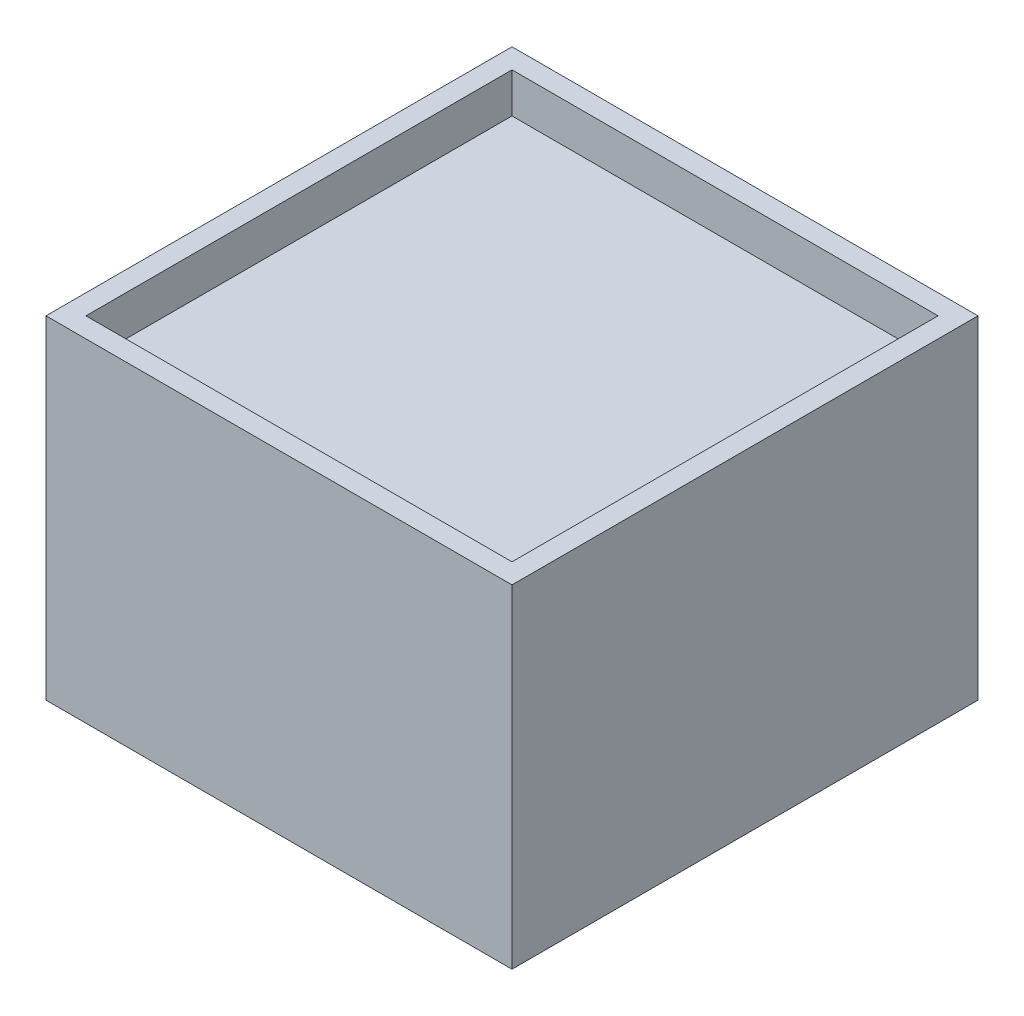
ISO-10303-21;
HEADER;
FILE_DESCRIPTION(('STEP AP214'),'2;1');
FILE_NAME('part.step','',(''),(''),'','','');
FILE_SCHEMA(('AUTOMOTIVE_DESIGN { 1 0 10303 214 1 1 1 1 }'));
ENDSEC;
DATA;
#1=APPLICATION_CONTEXT('core data for automotive mechanical design processes');
#2=APPLICATION_PROTOCOL_DEFINITION('international standard','automotive_design',2000,#1);
#3=PRODUCT_CONTEXT('',#1,'mechanical');
#4=PRODUCT('Part','Part','',(#3));
#5=PRODUCT_RELATED_PRODUCT_CATEGORY('part','',(#4));
#6=PRODUCT_DEFINITION_FORMATION('','',#4);
#7=PRODUCT_DEFINITION_CONTEXT('part definition',#1,'design');
#8=PRODUCT_DEFINITION('design','',#6,#7);
#9=PRODUCT_DEFINITION_SHAPE('','',#8);
#10=(LENGTH_UNIT() NAMED_UNIT(*) SI_UNIT(.MILLI.,.METRE.));
#11=(NAMED_UNIT(*) PLANE_ANGLE_UNIT() SI_UNIT($,.RADIAN.));
#12=(NAMED_UNIT(*) SI_UNIT($,.STERADIAN.) SOLID_ANGLE_UNIT());
#13=UNCERTAINTY_MEASURE_WITH_UNIT(LENGTH_MEASURE(1.E-05),#10,'distance_accuracy_value','');
#14=(GEOMETRIC_REPRESENTATION_CONTEXT(3) GLOBAL_UNCERTAINTY_ASSIGNED_CONTEXT((#13)) GLOBAL_UNIT_ASSIGNED_CONTEXT((#10,
#11,#12)) REPRESENTATION_CONTEXT('',''));
#15=CARTESIAN_POINT('',(0.,0.,0.));
#16=DIRECTION('',(0.,0.,1.));
#17=DIRECTION('',(1.,0.,0.));
#18=AXIS2_PLACEMENT_3D('',#15,#16,#17);
#19=CARTESIAN_POINT('',(17.5,25.,-17.5));
#20=DIRECTION('',(-1.,0.,0.));
#21=DIRECTION('',(0.,0.,1.));
#22=AXIS2_PLACEMENT_3D('',#19,#20,#21);
#23=PLANE('',#22);
#24=DIRECTION('',(0.,0.,-1.));
#25=VECTOR('',#24,1.);
#26=CARTESIAN_POINT('',(17.5,0.,-17.5));
#27=LINE('',#26,#25);
#28=CARTESIAN_POINT('',(17.5,0.,17.5));
#29=VERTEX_POINT('',#28);
#30=CARTESIAN_POINT('',(17.5,0.,-17.5));
#31=VERTEX_POINT('',#30);
#32=EDGE_CURVE('E164',#29,#31,#27,.T.);
#33=ORIENTED_EDGE('',*,*,#32,.T.);
#34=DIRECTION('',(0.,-1.,0.));
#35=VECTOR('',#34,1.);
#36=CARTESIAN_POINT('',(17.5,25.,-17.5));
#37=LINE('',#36,#35);
#38=CARTESIAN_POINT('',(17.5,25.,-17.5));
#39=VERTEX_POINT('',#38);
#40=EDGE_CURVE('E11',#39,#31,#37,.T.);
#41=ORIENTED_EDGE('',*,*,#40,.F.);
#42=DIRECTION('',(0.,0.,-1.));
#43=VECTOR('',#42,1.);
#44=CARTESIAN_POINT('',(17.5,25.,-17.5));
#45=LINE('',#44,#43);
#46=CARTESIAN_POINT('',(17.5,25.,17.5));
#47=VERTEX_POINT('',#46);
#48=EDGE_CURVE('E170',#47,#39,#45,.T.);
#49=ORIENTED_EDGE('',*,*,#48,.F.);
#50=DIRECTION('',(0.,-1.,0.));
#51=VECTOR('',#50,1.);
#52=CARTESIAN_POINT('',(17.5,25.,17.5));
#53=LINE('',#52,#51);
#54=EDGE_CURVE('E180',#47,#29,#53,.T.);
#55=ORIENTED_EDGE('',*,*,#54,.T.);
#56=EDGE_LOOP('',(#33,#41,#49,#55));
#57=FACE_BOUND('',#56,.T.);
#58=ADVANCED_FACE('F45',(#57),#23,.F.);
#59=CARTESIAN_POINT('',(-17.5,25.,-17.5));
#60=DIRECTION('',(0.,0.,1.));
#61=DIRECTION('',(1.,0.,0.));
#62=AXIS2_PLACEMENT_3D('',#59,#60,#61);
#63=PLANE('',#62);
#64=DIRECTION('',(-1.,0.,0.));
#65=VECTOR('',#64,1.);
#66=CARTESIAN_POINT('',(-17.5,0.,-17.5));
#67=LINE('',#66,#65);
#68=CARTESIAN_POINT('',(-17.5,0.,-17.5));
#69=VERTEX_POINT('',#68);
#70=EDGE_CURVE('E184',#31,#69,#67,.T.);
#71=ORIENTED_EDGE('',*,*,#70,.T.);
#72=DIRECTION('',(0.,-1.,0.));
#73=VECTOR('',#72,1.);
#74=CARTESIAN_POINT('',(-17.5,25.,-17.5));
#75=LINE('',#74,#73);
#76=CARTESIAN_POINT('',(-17.5,25.,-17.5));
#77=VERTEX_POINT('',#76);
#78=EDGE_CURVE('E53',#77,#69,#75,.T.);
#79=ORIENTED_EDGE('',*,*,#78,.F.);
#80=DIRECTION('',(-1.,0.,0.));
#81=VECTOR('',#80,1.);
#82=CARTESIAN_POINT('',(-17.5,25.,-17.5));
#83=LINE('',#82,#81);
#84=EDGE_CURVE('E97',#39,#77,#83,.T.);
#85=ORIENTED_EDGE('',*,*,#84,.F.);
#86=ORIENTED_EDGE('',*,*,#40,.T.);
#87=EDGE_LOOP('',(#71,#79,#85,#86));
#88=FACE_BOUND('',#87,.T.);
#89=ADVANCED_FACE('F220',(#88),#63,.F.);
#90=CARTESIAN_POINT('',(-17.5,25.,-17.5));
#91=DIRECTION('',(1.,0.,0.));
#92=DIRECTION('',(0.,0.,-1.));
#93=AXIS2_PLACEMENT_3D('',#90,#91,#92);
#94=PLANE('',#93);
#95=DIRECTION('',(0.,0.,1.));
#96=VECTOR('',#95,1.);
#97=CARTESIAN_POINT('',(-17.5,0.,-17.5));
#98=LINE('',#97,#96);
#99=CARTESIAN_POINT('',(-17.5,0.,17.5));
#100=VERTEX_POINT('',#99);
#101=EDGE_CURVE('E187',#69,#100,#98,.T.);
#102=ORIENTED_EDGE('',*,*,#101,.T.);
#103=DIRECTION('',(0.,-1.,0.));
#104=VECTOR('',#103,1.);
#105=CARTESIAN_POINT('',(-17.5,25.,17.5));
#106=LINE('',#105,#104);
#107=CARTESIAN_POINT('',(-17.5,25.,17.5));
#108=VERTEX_POINT('',#107);
#109=EDGE_CURVE('E194',#108,#100,#106,.T.);
#110=ORIENTED_EDGE('',*,*,#109,.F.);
#111=DIRECTION('',(0.,0.,1.));
#112=VECTOR('',#111,1.);
#113=CARTESIAN_POINT('',(-17.5,25.,-17.5));
#114=LINE('',#113,#112);
#115=EDGE_CURVE('E175',#77,#108,#114,.T.);
#116=ORIENTED_EDGE('',*,*,#115,.F.);
#117=ORIENTED_EDGE('',*,*,#78,.T.);
#118=EDGE_LOOP('',(#102,#110,#116,#117));
#119=FACE_BOUND('',#118,.T.);
#120=ADVANCED_FACE('F201',(#119),#94,.F.);
#121=CARTESIAN_POINT('',(-17.5,25.,17.5));
#122=DIRECTION('',(0.,0.,-1.));
#123=DIRECTION('',(-1.,0.,0.));
#124=AXIS2_PLACEMENT_3D('',#121,#122,#123);
#125=PLANE('',#124);
#126=DIRECTION('',(1.,0.,0.));
#127=VECTOR('',#126,1.);
#128=CARTESIAN_POINT('',(-17.5,0.,17.5));
#129=LINE('',#128,#127);
#130=EDGE_CURVE('E90',#100,#29,#129,.T.);
#131=ORIENTED_EDGE('',*,*,#130,.T.);
#132=ORIENTED_EDGE('',*,*,#54,.F.);
#133=DIRECTION('',(1.,0.,0.));
#134=VECTOR('',#133,1.);
#135=CARTESIAN_POINT('',(-17.5,25.,17.5));
#136=LINE('',#135,#134);
#137=EDGE_CURVE('E69',#108,#47,#136,.T.);
#138=ORIENTED_EDGE('',*,*,#137,.F.);
#139=ORIENTED_EDGE('',*,*,#109,.T.);
#140=EDGE_LOOP('',(#131,#132,#138,#139));
#141=FACE_BOUND('',#140,.T.);
#142=ADVANCED_FACE('F209',(#141),#125,.F.);
#143=CARTESIAN_POINT('',(0.,25.,0.));
#144=DIRECTION('',(0.,1.,0.));
#145=DIRECTION('',(0.,0.,1.));
#146=AXIS2_PLACEMENT_3D('',#143,#144,#145);
#147=PLANE('',#146);
#148=DIRECTION('',(0.,0.,-1.));
#149=VECTOR('',#148,1.);
#150=CARTESIAN_POINT('',(16.,25.,-16.));
#151=LINE('',#150,#149);
#152=CARTESIAN_POINT('',(16.,25.,16.));
#153=VERTEX_POINT('',#152);
#154=CARTESIAN_POINT('',(16.,25.,-16.));
#155=VERTEX_POINT('',#154);
#156=EDGE_CURVE('E60',#153,#155,#151,.T.);
#157=ORIENTED_EDGE('',*,*,#156,.F.);
#158=DIRECTION('',(1.,0.,0.));
#159=VECTOR('',#158,1.);
#160=CARTESIAN_POINT('',(-16.,25.,16.));
#161=LINE('',#160,#159);
#162=CARTESIAN_POINT('',(-16.,25.,16.));
#163=VERTEX_POINT('',#162);
#164=EDGE_CURVE('E142',#163,#153,#161,.T.);
#165=ORIENTED_EDGE('',*,*,#164,.F.);
#166=DIRECTION('',(0.,0.,1.));
#167=VECTOR('',#166,1.);
#168=CARTESIAN_POINT('',(-16.,25.,-16.));
#169=LINE('',#168,#167);
#170=CARTESIAN_POINT('',(-16.,25.,-16.));
#171=VERTEX_POINT('',#170);
#172=EDGE_CURVE('E146',#171,#163,#169,.T.);
#173=ORIENTED_EDGE('',*,*,#172,.F.);
#174=DIRECTION('',(-1.,0.,0.));
#175=VECTOR('',#174,1.);
#176=CARTESIAN_POINT('',(-16.,25.,-16.));
#177=LINE('',#176,#175);
#178=EDGE_CURVE('E155',#155,#171,#177,.T.);
#179=ORIENTED_EDGE('',*,*,#178,.F.);
#180=EDGE_LOOP('',(#157,#165,#173,#179));
#181=FACE_BOUND('',#180,.T.);
#182=ORIENTED_EDGE('',*,*,#48,.T.);
#183=ORIENTED_EDGE('',*,*,#84,.T.);
#184=ORIENTED_EDGE('',*,*,#115,.T.);
#185=ORIENTED_EDGE('',*,*,#137,.T.);
#186=EDGE_LOOP('',(#182,#183,#184,#185));
#187=FACE_BOUND('',#186,.T.);
#188=ADVANCED_FACE('F211',(#181,#187),#147,.T.);
#189=CARTESIAN_POINT('',(0.,0.,0.));
#190=DIRECTION('',(0.,1.,0.));
#191=DIRECTION('',(0.,0.,1.));
#192=AXIS2_PLACEMENT_3D('',#189,#190,#191);
#193=PLANE('',#192);
#194=ORIENTED_EDGE('',*,*,#32,.F.);
#195=ORIENTED_EDGE('',*,*,#130,.F.);
#196=ORIENTED_EDGE('',*,*,#101,.F.);
#197=ORIENTED_EDGE('',*,*,#70,.F.);
#198=EDGE_LOOP('',(#194,#195,#196,#197));
#199=FACE_BOUND('',#198,.T.);
#200=ADVANCED_FACE('F205',(#199),#193,.F.);
#201=CARTESIAN_POINT('',(16.,22.,-16.));
#202=DIRECTION('',(1.,0.,0.));
#203=DIRECTION('',(0.,0.,-1.));
#204=AXIS2_PLACEMENT_3D('',#201,#202,#203);
#205=PLANE('',#204);
#206=ORIENTED_EDGE('',*,*,#156,.T.);
#207=DIRECTION('',(0.,1.,0.));
#208=VECTOR('',#207,1.);
#209=CARTESIAN_POINT('',(16.,22.,-16.));
#210=LINE('',#209,#208);
#211=CARTESIAN_POINT('',(16.,22.,-16.));
#212=VERTEX_POINT('',#211);
#213=EDGE_CURVE('E117',#212,#155,#210,.T.);
#214=ORIENTED_EDGE('',*,*,#213,.F.);
#215=DIRECTION('',(0.,0.,-1.));
#216=VECTOR('',#215,1.);
#217=CARTESIAN_POINT('',(16.,22.,-16.));
#218=LINE('',#217,#216);
#219=CARTESIAN_POINT('',(16.,22.,16.));
#220=VERTEX_POINT('',#219);
#221=EDGE_CURVE('E121',#220,#212,#218,.T.);
#222=ORIENTED_EDGE('',*,*,#221,.F.);
#223=DIRECTION('',(0.,1.,0.));
#224=VECTOR('',#223,1.);
#225=CARTESIAN_POINT('',(16.,22.,16.));
#226=LINE('',#225,#224);
#227=EDGE_CURVE('E161',#220,#153,#226,.T.);
#228=ORIENTED_EDGE('',*,*,#227,.T.);
#229=EDGE_LOOP('',(#206,#214,#222,#228));
#230=FACE_BOUND('',#229,.T.);
#231=ADVANCED_FACE('F119',(#230),#205,.F.);
#232=CARTESIAN_POINT('',(-16.,22.,16.));
#233=DIRECTION('',(0.,0.,1.));
#234=DIRECTION('',(1.,0.,0.));
#235=AXIS2_PLACEMENT_3D('',#232,#233,#234);
#236=PLANE('',#235);
#237=ORIENTED_EDGE('',*,*,#164,.T.);
#238=ORIENTED_EDGE('',*,*,#227,.F.);
#239=DIRECTION('',(1.,0.,0.));
#240=VECTOR('',#239,1.);
#241=CARTESIAN_POINT('',(-16.,22.,16.));
#242=LINE('',#241,#240);
#243=CARTESIAN_POINT('',(-16.,22.,16.));
#244=VERTEX_POINT('',#243);
#245=EDGE_CURVE('E128',#244,#220,#242,.T.);
#246=ORIENTED_EDGE('',*,*,#245,.F.);
#247=DIRECTION('',(0.,1.,0.));
#248=VECTOR('',#247,1.);
#249=CARTESIAN_POINT('',(-16.,22.,16.));
#250=LINE('',#249,#248);
#251=EDGE_CURVE('E165',#244,#163,#250,.T.);
#252=ORIENTED_EDGE('',*,*,#251,.T.);
#253=EDGE_LOOP('',(#237,#238,#246,#252));
#254=FACE_BOUND('',#253,.T.);
#255=ADVANCED_FACE('F260',(#254),#236,.F.);
#256=CARTESIAN_POINT('',(-16.,22.,-16.));
#257=DIRECTION('',(-1.,0.,0.));
#258=DIRECTION('',(0.,0.,1.));
#259=AXIS2_PLACEMENT_3D('',#256,#257,#258);
#260=PLANE('',#259);
#261=ORIENTED_EDGE('',*,*,#172,.T.);
#262=ORIENTED_EDGE('',*,*,#251,.F.);
#263=DIRECTION('',(0.,0.,1.));
#264=VECTOR('',#263,1.);
#265=CARTESIAN_POINT('',(-16.,22.,-16.));
#266=LINE('',#265,#264);
#267=CARTESIAN_POINT('',(-16.,22.,-16.));
#268=VERTEX_POINT('',#267);
#269=EDGE_CURVE('E137',#268,#244,#266,.T.);
#270=ORIENTED_EDGE('',*,*,#269,.F.);
#271=DIRECTION('',(0.,1.,0.));
#272=VECTOR('',#271,1.);
#273=CARTESIAN_POINT('',(-16.,22.,-16.));
#274=LINE('',#273,#272);
#275=EDGE_CURVE('E127',#268,#171,#274,.T.);
#276=ORIENTED_EDGE('',*,*,#275,.T.);
#277=EDGE_LOOP('',(#261,#262,#270,#276));
#278=FACE_BOUND('',#277,.T.);
#279=ADVANCED_FACE('F269',(#278),#260,.F.);
#280=CARTESIAN_POINT('',(-16.,22.,-16.));
#281=DIRECTION('',(0.,0.,-1.));
#282=DIRECTION('',(-1.,0.,0.));
#283=AXIS2_PLACEMENT_3D('',#280,#281,#282);
#284=PLANE('',#283);
#285=ORIENTED_EDGE('',*,*,#178,.T.);
#286=ORIENTED_EDGE('',*,*,#275,.F.);
#287=DIRECTION('',(-1.,0.,0.));
#288=VECTOR('',#287,1.);
#289=CARTESIAN_POINT('',(-16.,22.,-16.));
#290=LINE('',#289,#288);
#291=EDGE_CURVE('E131',#212,#268,#290,.T.);
#292=ORIENTED_EDGE('',*,*,#291,.F.);
#293=ORIENTED_EDGE('',*,*,#213,.T.);
#294=EDGE_LOOP('',(#285,#286,#292,#293));
#295=FACE_BOUND('',#294,.T.);
#296=ADVANCED_FACE('F132',(#295),#284,.F.);
#297=CARTESIAN_POINT('',(0.,22.,0.));
#298=DIRECTION('',(0.,1.,0.));
#299=DIRECTION('',(0.,0.,1.));
#300=AXIS2_PLACEMENT_3D('',#297,#298,#299);
#301=PLANE('',#300);
#302=ORIENTED_EDGE('',*,*,#221,.T.);
#303=ORIENTED_EDGE('',*,*,#291,.T.);
#304=ORIENTED_EDGE('',*,*,#269,.T.);
#305=ORIENTED_EDGE('',*,*,#245,.T.);
#306=EDGE_LOOP('',(#302,#303,#304,#305));
#307=FACE_BOUND('',#306,.T.);
#308=ADVANCED_FACE('F139',(#307),#301,.T.);
#309=CLOSED_SHELL('',(#58,#89,#120,#142,#188,#200,#231,#255,#279,#296,#308));
#310=MANIFOLD_SOLID_BREP('B2',#309);
#311=ADVANCED_BREP_SHAPE_REPRESENTATION('',(#18,#310),#14);
#312=SHAPE_DEFINITION_REPRESENTATION(#9,#311);
ENDSEC;
END-ISO-10303-21;
